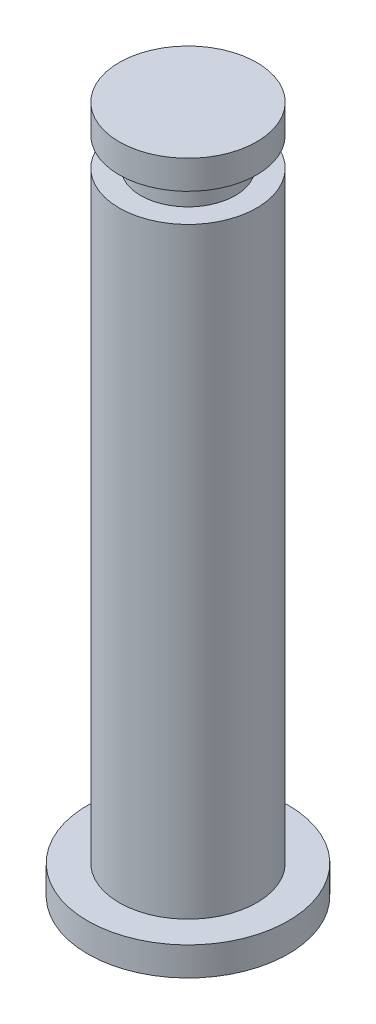
ISO-10303-21;
HEADER;
FILE_DESCRIPTION(('STEP AP214'),'2;1');
FILE_NAME('part.step','',(''),(''),'','','');
FILE_SCHEMA(('AUTOMOTIVE_DESIGN { 1 0 10303 214 1 1 1 1 }'));
ENDSEC;
DATA;
#1=APPLICATION_CONTEXT('core data for automotive mechanical design processes');
#2=APPLICATION_PROTOCOL_DEFINITION('international standard','automotive_design',2000,#1);
#3=PRODUCT_CONTEXT('',#1,'mechanical');
#4=PRODUCT('Part','Part','',(#3));
#5=PRODUCT_RELATED_PRODUCT_CATEGORY('part','',(#4));
#6=PRODUCT_DEFINITION_FORMATION('','',#4);
#7=PRODUCT_DEFINITION_CONTEXT('part definition',#1,'design');
#8=PRODUCT_DEFINITION('design','',#6,#7);
#9=PRODUCT_DEFINITION_SHAPE('','',#8);
#10=(LENGTH_UNIT() NAMED_UNIT(*) SI_UNIT(.MILLI.,.METRE.));
#11=(NAMED_UNIT(*) PLANE_ANGLE_UNIT() SI_UNIT($,.RADIAN.));
#12=(NAMED_UNIT(*) SI_UNIT($,.STERADIAN.) SOLID_ANGLE_UNIT());
#13=UNCERTAINTY_MEASURE_WITH_UNIT(LENGTH_MEASURE(1.E-05),#10,'distance_accuracy_value','');
#14=(GEOMETRIC_REPRESENTATION_CONTEXT(3) GLOBAL_UNCERTAINTY_ASSIGNED_CONTEXT((#13)) GLOBAL_UNIT_ASSIGNED_CONTEXT((#10,
#11,#12)) REPRESENTATION_CONTEXT('',''));
#15=CARTESIAN_POINT('',(0.,0.,0.));
#16=DIRECTION('',(0.,0.,1.));
#17=DIRECTION('',(1.,0.,0.));
#18=AXIS2_PLACEMENT_3D('',#15,#16,#17);
#19=CARTESIAN_POINT('',(0.,24.,0.));
#20=DIRECTION('',(0.,-1.,0.));
#21=DIRECTION('',(0.,0.,-1.));
#22=AXIS2_PLACEMENT_3D('',#19,#20,#21);
#23=CYLINDRICAL_SURFACE('',#22,2.4);
#24=CARTESIAN_POINT('',(0.,1.,0.));
#25=DIRECTION('',(0.,1.,0.));
#26=DIRECTION('',(0.,0.,1.));
#27=AXIS2_PLACEMENT_3D('',#24,#25,#26);
#28=CIRCLE('',#27,2.4);
#29=CARTESIAN_POINT('',(0.,1.,2.4));
#30=VERTEX_POINT('',#29);
#31=EDGE_CURVE('E50',#30,#30,#28,.T.);
#32=ORIENTED_EDGE('',*,*,#31,.T.);
#33=EDGE_LOOP('',(#32));
#34=FACE_BOUND('',#33,.T.);
#35=CARTESIAN_POINT('',(0.,22.,0.));
#36=DIRECTION('',(0.,1.,0.));
#37=DIRECTION('',(0.,0.,1.));
#38=AXIS2_PLACEMENT_3D('',#35,#36,#37);
#39=CIRCLE('',#38,2.4);
#40=CARTESIAN_POINT('',(0.,22.,2.4));
#41=VERTEX_POINT('',#40);
#42=EDGE_CURVE('E57',#41,#41,#39,.T.);
#43=ORIENTED_EDGE('',*,*,#42,.F.);
#44=EDGE_LOOP('',(#43));
#45=FACE_BOUND('',#44,.T.);
#46=ADVANCED_FACE('F39',(#34,#45),#23,.T.);
#47=CARTESIAN_POINT('',(0.,1.,0.));
#48=DIRECTION('',(0.,1.,0.));
#49=DIRECTION('',(0.,0.,1.));
#50=AXIS2_PLACEMENT_3D('',#47,#48,#49);
#51=PLANE('',#50);
#52=CARTESIAN_POINT('',(0.,1.,0.));
#53=DIRECTION('',(0.,1.,0.));
#54=DIRECTION('',(0.,0.,1.));
#55=AXIS2_PLACEMENT_3D('',#52,#53,#54);
#56=CIRCLE('',#55,3.5);
#57=CARTESIAN_POINT('',(0.,1.,3.5));
#58=VERTEX_POINT('',#57);
#59=EDGE_CURVE('E10',#58,#58,#56,.T.);
#60=ORIENTED_EDGE('',*,*,#59,.T.);
#61=EDGE_LOOP('',(#60));
#62=FACE_BOUND('',#61,.T.);
#63=ORIENTED_EDGE('',*,*,#31,.F.);
#64=EDGE_LOOP('',(#63));
#65=FACE_BOUND('',#64,.T.);
#66=ADVANCED_FACE('F81',(#62,#65),#51,.T.);
#67=CARTESIAN_POINT('',(0.,0.,0.));
#68=DIRECTION('',(0.,1.,0.));
#69=DIRECTION('',(0.,0.,1.));
#70=AXIS2_PLACEMENT_3D('',#67,#68,#69);
#71=PLANE('',#70);
#72=CARTESIAN_POINT('',(0.,0.,0.));
#73=DIRECTION('',(0.,1.,0.));
#74=DIRECTION('',(0.,0.,1.));
#75=AXIS2_PLACEMENT_3D('',#72,#73,#74);
#76=CIRCLE('',#75,3.5);
#77=CARTESIAN_POINT('',(0.,0.,3.5));
#78=VERTEX_POINT('',#77);
#79=EDGE_CURVE('E43',#78,#78,#76,.T.);
#80=ORIENTED_EDGE('',*,*,#79,.F.);
#81=EDGE_LOOP('',(#80));
#82=FACE_BOUND('',#81,.T.);
#83=ADVANCED_FACE('F89',(#82),#71,.F.);
#84=CARTESIAN_POINT('',(0.,1.,0.));
#85=DIRECTION('',(0.,-1.,0.));
#86=DIRECTION('',(0.,0.,-1.));
#87=AXIS2_PLACEMENT_3D('',#84,#85,#86);
#88=CYLINDRICAL_SURFACE('',#87,3.5);
#89=ORIENTED_EDGE('',*,*,#59,.F.);
#90=EDGE_LOOP('',(#89));
#91=FACE_BOUND('',#90,.T.);
#92=ORIENTED_EDGE('',*,*,#79,.T.);
#93=EDGE_LOOP('',(#92));
#94=FACE_BOUND('',#93,.T.);
#95=ADVANCED_FACE('F41',(#91,#94),#88,.T.);
#96=CARTESIAN_POINT('',(0.,22.,0.));
#97=DIRECTION('',(0.,1.,0.));
#98=DIRECTION('',(0.,0.,1.));
#99=AXIS2_PLACEMENT_3D('',#96,#97,#98);
#100=PLANE('',#99);
#101=CARTESIAN_POINT('',(0.,22.,0.));
#102=DIRECTION('',(0.,1.,0.));
#103=DIRECTION('',(0.,0.,1.));
#104=AXIS2_PLACEMENT_3D('',#101,#102,#103);
#105=CIRCLE('',#104,1.65);
#106=CARTESIAN_POINT('',(0.,22.,1.65));
#107=VERTEX_POINT('',#106);
#108=EDGE_CURVE('E61',#107,#107,#105,.T.);
#109=ORIENTED_EDGE('',*,*,#108,.F.);
#110=EDGE_LOOP('',(#109));
#111=FACE_BOUND('',#110,.T.);
#112=ORIENTED_EDGE('',*,*,#42,.T.);
#113=EDGE_LOOP('',(#112));
#114=FACE_BOUND('',#113,.T.);
#115=ADVANCED_FACE('F73',(#111,#114),#100,.T.);
#116=CARTESIAN_POINT('',(0.,23.,0.));
#117=DIRECTION('',(0.,1.,0.));
#118=DIRECTION('',(0.,0.,1.));
#119=AXIS2_PLACEMENT_3D('',#116,#117,#118);
#120=PLANE('',#119);
#121=CARTESIAN_POINT('',(0.,23.,0.));
#122=DIRECTION('',(0.,1.,0.));
#123=DIRECTION('',(0.,0.,1.));
#124=AXIS2_PLACEMENT_3D('',#121,#122,#123);
#125=CIRCLE('',#124,1.65);
#126=CARTESIAN_POINT('',(0.,23.,1.65));
#127=VERTEX_POINT('',#126);
#128=EDGE_CURVE('E64',#127,#127,#125,.T.);
#129=ORIENTED_EDGE('',*,*,#128,.T.);
#130=EDGE_LOOP('',(#129));
#131=FACE_BOUND('',#130,.T.);
#132=CARTESIAN_POINT('',(0.,23.,0.));
#133=DIRECTION('',(0.,1.,0.));
#134=DIRECTION('',(0.,0.,1.));
#135=AXIS2_PLACEMENT_3D('',#132,#133,#134);
#136=CIRCLE('',#135,2.4);
#137=CARTESIAN_POINT('',(0.,23.,2.4));
#138=VERTEX_POINT('',#137);
#139=EDGE_CURVE('E58',#138,#138,#136,.T.);
#140=ORIENTED_EDGE('',*,*,#139,.F.);
#141=EDGE_LOOP('',(#140));
#142=FACE_BOUND('',#141,.T.);
#143=ADVANCED_FACE('F76',(#131,#142),#120,.F.);
#144=CARTESIAN_POINT('',(0.,22.,0.));
#145=DIRECTION('',(0.,1.,0.));
#146=DIRECTION('',(0.,0.,1.));
#147=AXIS2_PLACEMENT_3D('',#144,#145,#146);
#148=CYLINDRICAL_SURFACE('',#147,1.65);
#149=ORIENTED_EDGE('',*,*,#108,.T.);
#150=EDGE_LOOP('',(#149));
#151=FACE_BOUND('',#150,.T.);
#152=ORIENTED_EDGE('',*,*,#128,.F.);
#153=EDGE_LOOP('',(#152));
#154=FACE_BOUND('',#153,.T.);
#155=ADVANCED_FACE('F70',(#151,#154),#148,.T.);
#156=CARTESIAN_POINT('',(0.,24.,0.));
#157=DIRECTION('',(0.,1.,0.));
#158=DIRECTION('',(0.,0.,1.));
#159=AXIS2_PLACEMENT_3D('',#156,#157,#158);
#160=PLANE('',#159);
#161=CARTESIAN_POINT('',(0.,24.,0.));
#162=DIRECTION('',(0.,1.,0.));
#163=DIRECTION('',(0.,0.,1.));
#164=AXIS2_PLACEMENT_3D('',#161,#162,#163);
#165=CIRCLE('',#164,2.4);
#166=CARTESIAN_POINT('',(0.,24.,2.4));
#167=VERTEX_POINT('',#166);
#168=EDGE_CURVE('E54',#167,#167,#165,.T.);
#169=ORIENTED_EDGE('',*,*,#168,.T.);
#170=EDGE_LOOP('',(#169));
#171=FACE_BOUND('',#170,.T.);
#172=ADVANCED_FACE('F93',(#171),#160,.T.);
#173=ORIENTED_EDGE('',*,*,#139,.T.);
#174=EDGE_LOOP('',(#173));
#175=FACE_BOUND('',#174,.T.);
#176=ORIENTED_EDGE('',*,*,#168,.F.);
#177=EDGE_LOOP('',(#176));
#178=FACE_BOUND('',#177,.T.);
#179=ADVANCED_FACE('F84',(#175,#178),#23,.T.);
#180=CLOSED_SHELL('',(#46,#66,#83,#95,#115,#143,#155,#172,#179));
#181=MANIFOLD_SOLID_BREP('B2',#180);
#182=ADVANCED_BREP_SHAPE_REPRESENTATION('',(#18,#181),#14);
#183=SHAPE_DEFINITION_REPRESENTATION(#9,#182);
ENDSEC;
END-ISO-10303-21;
